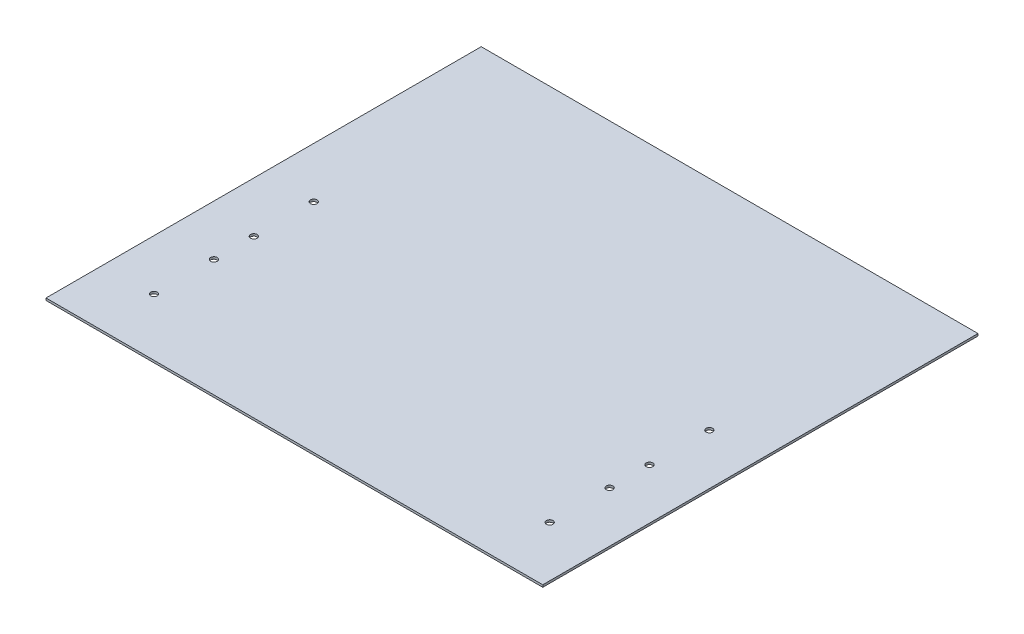
ISO-10303-21;
HEADER;
FILE_DESCRIPTION(('STEP AP214'),'2;1');
FILE_NAME('part.step','',(''),(''),'','','');
FILE_SCHEMA(('AUTOMOTIVE_DESIGN { 1 0 10303 214 1 1 1 1 }'));
ENDSEC;
DATA;
#1=APPLICATION_CONTEXT('core data for automotive mechanical design processes');
#2=APPLICATION_PROTOCOL_DEFINITION('international standard','automotive_design',2000,#1);
#3=PRODUCT_CONTEXT('',#1,'mechanical');
#4=PRODUCT('Part','Part','',(#3));
#5=PRODUCT_RELATED_PRODUCT_CATEGORY('part','',(#4));
#6=PRODUCT_DEFINITION_FORMATION('','',#4);
#7=PRODUCT_DEFINITION_CONTEXT('part definition',#1,'design');
#8=PRODUCT_DEFINITION('design','',#6,#7);
#9=PRODUCT_DEFINITION_SHAPE('','',#8);
#10=(LENGTH_UNIT() NAMED_UNIT(*) SI_UNIT(.MILLI.,.METRE.));
#11=(NAMED_UNIT(*) PLANE_ANGLE_UNIT() SI_UNIT($,.RADIAN.));
#12=(NAMED_UNIT(*) SI_UNIT($,.STERADIAN.) SOLID_ANGLE_UNIT());
#13=UNCERTAINTY_MEASURE_WITH_UNIT(LENGTH_MEASURE(1.E-05),#10,'distance_accuracy_value','');
#14=(GEOMETRIC_REPRESENTATION_CONTEXT(3) GLOBAL_UNCERTAINTY_ASSIGNED_CONTEXT((#13)) GLOBAL_UNIT_ASSIGNED_CONTEXT((#10,
#11,#12)) REPRESENTATION_CONTEXT('',''));
#15=CARTESIAN_POINT('',(0.,0.,0.));
#16=DIRECTION('',(0.,0.,1.));
#17=DIRECTION('',(1.,0.,0.));
#18=AXIS2_PLACEMENT_3D('',#15,#16,#17);
#19=CARTESIAN_POINT('',(0.,1.,0.));
#20=DIRECTION('',(1.,0.,0.));
#21=DIRECTION('',(0.,0.,-1.));
#22=AXIS2_PLACEMENT_3D('',#19,#20,#21);
#23=PLANE('',#22);
#24=DIRECTION('',(0.,0.,1.));
#25=VECTOR('',#24,1.);
#26=CARTESIAN_POINT('',(0.,0.,0.));
#27=LINE('',#26,#25);
#28=CARTESIAN_POINT('',(0.,0.,-198.));
#29=VERTEX_POINT('',#28);
#30=CARTESIAN_POINT('',(0.,0.,0.));
#31=VERTEX_POINT('',#30);
#32=EDGE_CURVE('E96',#29,#31,#27,.T.);
#33=ORIENTED_EDGE('',*,*,#32,.T.);
#34=DIRECTION('',(0.,-1.,0.));
#35=VECTOR('',#34,1.);
#36=CARTESIAN_POINT('',(0.,1.,0.));
#37=LINE('',#36,#35);
#38=CARTESIAN_POINT('',(0.,1.,0.));
#39=VERTEX_POINT('',#38);
#40=EDGE_CURVE('E11',#39,#31,#37,.T.);
#41=ORIENTED_EDGE('',*,*,#40,.F.);
#42=DIRECTION('',(0.,0.,1.));
#43=VECTOR('',#42,1.);
#44=CARTESIAN_POINT('',(0.,1.,0.));
#45=LINE('',#44,#43);
#46=CARTESIAN_POINT('',(0.,1.,-198.));
#47=VERTEX_POINT('',#46);
#48=EDGE_CURVE('E84',#47,#39,#45,.T.);
#49=ORIENTED_EDGE('',*,*,#48,.F.);
#50=DIRECTION('',(0.,-1.,0.));
#51=VECTOR('',#50,1.);
#52=CARTESIAN_POINT('',(0.,1.,-198.));
#53=LINE('',#52,#51);
#54=EDGE_CURVE('E92',#47,#29,#53,.T.);
#55=ORIENTED_EDGE('',*,*,#54,.T.);
#56=EDGE_LOOP('',(#33,#41,#49,#55));
#57=FACE_BOUND('',#56,.T.);
#58=ADVANCED_FACE('F33',(#57),#23,.F.);
#59=CARTESIAN_POINT('',(0.,1.,0.));
#60=DIRECTION('',(0.,0.,-1.));
#61=DIRECTION('',(-1.,0.,0.));
#62=AXIS2_PLACEMENT_3D('',#59,#60,#61);
#63=PLANE('',#62);
#64=DIRECTION('',(1.,0.,0.));
#65=VECTOR('',#64,1.);
#66=CARTESIAN_POINT('',(0.,0.,0.));
#67=LINE('',#66,#65);
#68=CARTESIAN_POINT('',(226.,0.,0.));
#69=VERTEX_POINT('',#68);
#70=EDGE_CURVE('E88',#31,#69,#67,.T.);
#71=ORIENTED_EDGE('',*,*,#70,.T.);
#72=DIRECTION('',(0.,-1.,0.));
#73=VECTOR('',#72,1.);
#74=CARTESIAN_POINT('',(226.,1.,0.));
#75=LINE('',#74,#73);
#76=CARTESIAN_POINT('',(226.,1.,0.));
#77=VERTEX_POINT('',#76);
#78=EDGE_CURVE('E41',#77,#69,#75,.T.);
#79=ORIENTED_EDGE('',*,*,#78,.F.);
#80=DIRECTION('',(1.,0.,0.));
#81=VECTOR('',#80,1.);
#82=CARTESIAN_POINT('',(0.,1.,0.));
#83=LINE('',#82,#81);
#84=EDGE_CURVE('E79',#39,#77,#83,.T.);
#85=ORIENTED_EDGE('',*,*,#84,.F.);
#86=ORIENTED_EDGE('',*,*,#40,.T.);
#87=EDGE_LOOP('',(#71,#79,#85,#86));
#88=FACE_BOUND('',#87,.T.);
#89=ADVANCED_FACE('F87',(#88),#63,.F.);
#90=CARTESIAN_POINT('',(226.,1.,0.));
#91=DIRECTION('',(-1.,0.,0.));
#92=DIRECTION('',(0.,0.,1.));
#93=AXIS2_PLACEMENT_3D('',#90,#91,#92);
#94=PLANE('',#93);
#95=DIRECTION('',(0.,0.,-1.));
#96=VECTOR('',#95,1.);
#97=CARTESIAN_POINT('',(226.,0.,0.));
#98=LINE('',#97,#96);
#99=CARTESIAN_POINT('',(226.,0.,-198.));
#100=VERTEX_POINT('',#99);
#101=EDGE_CURVE('E66',#69,#100,#98,.T.);
#102=ORIENTED_EDGE('',*,*,#101,.T.);
#103=DIRECTION('',(0.,-1.,0.));
#104=VECTOR('',#103,1.);
#105=CARTESIAN_POINT('',(226.,1.,-198.));
#106=LINE('',#105,#104);
#107=CARTESIAN_POINT('',(226.,1.,-198.));
#108=VERTEX_POINT('',#107);
#109=EDGE_CURVE('E89',#108,#100,#106,.T.);
#110=ORIENTED_EDGE('',*,*,#109,.F.);
#111=DIRECTION('',(0.,0.,-1.));
#112=VECTOR('',#111,1.);
#113=CARTESIAN_POINT('',(226.,1.,0.));
#114=LINE('',#113,#112);
#115=EDGE_CURVE('E82',#77,#108,#114,.T.);
#116=ORIENTED_EDGE('',*,*,#115,.F.);
#117=ORIENTED_EDGE('',*,*,#78,.T.);
#118=EDGE_LOOP('',(#102,#110,#116,#117));
#119=FACE_BOUND('',#118,.T.);
#120=ADVANCED_FACE('F90',(#119),#94,.F.);
#121=CARTESIAN_POINT('',(0.,1.,-198.));
#122=DIRECTION('',(0.,0.,1.));
#123=DIRECTION('',(1.,0.,0.));
#124=AXIS2_PLACEMENT_3D('',#121,#122,#123);
#125=PLANE('',#124);
#126=DIRECTION('',(-1.,0.,0.));
#127=VECTOR('',#126,1.);
#128=CARTESIAN_POINT('',(0.,0.,-198.));
#129=LINE('',#128,#127);
#130=EDGE_CURVE('E72',#100,#29,#129,.T.);
#131=ORIENTED_EDGE('',*,*,#130,.T.);
#132=ORIENTED_EDGE('',*,*,#54,.F.);
#133=DIRECTION('',(-1.,0.,0.));
#134=VECTOR('',#133,1.);
#135=CARTESIAN_POINT('',(0.,1.,-198.));
#136=LINE('',#135,#134);
#137=EDGE_CURVE('E49',#108,#47,#136,.T.);
#138=ORIENTED_EDGE('',*,*,#137,.F.);
#139=ORIENTED_EDGE('',*,*,#109,.T.);
#140=EDGE_LOOP('',(#131,#132,#138,#139));
#141=FACE_BOUND('',#140,.T.);
#142=ADVANCED_FACE('F104',(#141),#125,.F.);
#143=CARTESIAN_POINT('',(0.,1.,0.));
#144=DIRECTION('',(0.,-1.,0.));
#145=DIRECTION('',(0.,0.,-1.));
#146=AXIS2_PLACEMENT_3D('',#143,#144,#145);
#147=PLANE('',#146);
#148=CARTESIAN_POINT('',(23.,1.,-53.4));
#149=DIRECTION('',(0.,1.,0.));
#150=DIRECTION('',(0.,0.,1.));
#151=AXIS2_PLACEMENT_3D('',#148,#149,#150);
#152=CIRCLE('',#151,1.49999999999997);
#153=CARTESIAN_POINT('',(23.,1.,-51.9));
#154=VERTEX_POINT('',#153);
#155=EDGE_CURVE('E135',#154,#154,#152,.T.);
#156=ORIENTED_EDGE('',*,*,#155,.F.);
#157=EDGE_LOOP('',(#156));
#158=FACE_BOUND('',#157,.T.);
#159=CARTESIAN_POINT('',(23.,1.,-71.5577619712243));
#160=DIRECTION('',(0.,1.,0.));
#161=DIRECTION('',(0.,0.,1.));
#162=AXIS2_PLACEMENT_3D('',#159,#160,#161);
#163=CIRCLE('',#162,1.49999999999997);
#164=CARTESIAN_POINT('',(23.,1.,-70.0577619712243));
#165=VERTEX_POINT('',#164);
#166=EDGE_CURVE('E129',#165,#165,#163,.T.);
#167=ORIENTED_EDGE('',*,*,#166,.F.);
#168=EDGE_LOOP('',(#167));
#169=FACE_BOUND('',#168,.T.);
#170=CARTESIAN_POINT('',(203.,1.,-26.16));
#171=DIRECTION('',(0.,1.,0.));
#172=DIRECTION('',(0.,0.,-1.));
#173=AXIS2_PLACEMENT_3D('',#170,#171,#172);
#174=CIRCLE('',#173,1.49999999999997);
#175=CARTESIAN_POINT('',(203.,1.,-27.66));
#176=VERTEX_POINT('',#175);
#177=EDGE_CURVE('E123',#176,#176,#174,.T.);
#178=ORIENTED_EDGE('',*,*,#177,.F.);
#179=EDGE_LOOP('',(#178));
#180=FACE_BOUND('',#179,.T.);
#181=CARTESIAN_POINT('',(203.,1.,-53.4));
#182=DIRECTION('',(0.,1.,0.));
#183=DIRECTION('',(0.,0.,-1.));
#184=AXIS2_PLACEMENT_3D('',#181,#182,#183);
#185=CIRCLE('',#184,1.49999999999997);
#186=CARTESIAN_POINT('',(203.,1.,-54.9));
#187=VERTEX_POINT('',#186);
#188=EDGE_CURVE('E116',#187,#187,#185,.T.);
#189=ORIENTED_EDGE('',*,*,#188,.F.);
#190=EDGE_LOOP('',(#189));
#191=FACE_BOUND('',#190,.T.);
#192=CARTESIAN_POINT('',(203.,1.,-71.5577619712243));
#193=DIRECTION('',(0.,1.,0.));
#194=DIRECTION('',(0.,0.,-1.));
#195=AXIS2_PLACEMENT_3D('',#192,#193,#194);
#196=CIRCLE('',#195,1.49999999999997);
#197=CARTESIAN_POINT('',(203.,1.,-73.0577619712242));
#198=VERTEX_POINT('',#197);
#199=EDGE_CURVE('E152',#198,#198,#196,.T.);
#200=ORIENTED_EDGE('',*,*,#199,.F.);
#201=EDGE_LOOP('',(#200));
#202=FACE_BOUND('',#201,.T.);
#203=CARTESIAN_POINT('',(203.,1.,-98.7977619948428));
#204=DIRECTION('',(0.,1.,0.));
#205=DIRECTION('',(0.,0.,-1.));
#206=AXIS2_PLACEMENT_3D('',#203,#204,#205);
#207=CIRCLE('',#206,1.49999999999997);
#208=CARTESIAN_POINT('',(203.,1.,-100.297761994843));
#209=VERTEX_POINT('',#208);
#210=EDGE_CURVE('E146',#209,#209,#207,.T.);
#211=ORIENTED_EDGE('',*,*,#210,.F.);
#212=EDGE_LOOP('',(#211));
#213=FACE_BOUND('',#212,.T.);
#214=CARTESIAN_POINT('',(23.,1.,-98.7977619948428));
#215=DIRECTION('',(0.,1.,0.));
#216=DIRECTION('',(0.,0.,1.));
#217=AXIS2_PLACEMENT_3D('',#214,#215,#216);
#218=CIRCLE('',#217,1.49999999999997);
#219=CARTESIAN_POINT('',(23.,1.,-97.2977619948428));
#220=VERTEX_POINT('',#219);
#221=EDGE_CURVE('E140',#220,#220,#218,.T.);
#222=ORIENTED_EDGE('',*,*,#221,.F.);
#223=EDGE_LOOP('',(#222));
#224=FACE_BOUND('',#223,.T.);
#225=CARTESIAN_POINT('',(23.,1.,-26.16));
#226=DIRECTION('',(0.,1.,0.));
#227=DIRECTION('',(0.,0.,1.));
#228=AXIS2_PLACEMENT_3D('',#225,#226,#227);
#229=CIRCLE('',#228,1.49999999999997);
#230=CARTESIAN_POINT('',(23.,1.,-24.66));
#231=VERTEX_POINT('',#230);
#232=EDGE_CURVE('E110',#231,#231,#229,.T.);
#233=ORIENTED_EDGE('',*,*,#232,.F.);
#234=EDGE_LOOP('',(#233));
#235=FACE_BOUND('',#234,.T.);
#236=ORIENTED_EDGE('',*,*,#48,.T.);
#237=ORIENTED_EDGE('',*,*,#84,.T.);
#238=ORIENTED_EDGE('',*,*,#115,.T.);
#239=ORIENTED_EDGE('',*,*,#137,.T.);
#240=EDGE_LOOP('',(#236,#237,#238,#239));
#241=FACE_BOUND('',#240,.T.);
#242=ADVANCED_FACE('F80',(#158,#169,#180,#191,#202,#213,#224,#235,#241),#147,.F.);
#243=CARTESIAN_POINT('',(0.,0.,0.));
#244=DIRECTION('',(0.,-1.,0.));
#245=DIRECTION('',(0.,0.,-1.));
#246=AXIS2_PLACEMENT_3D('',#243,#244,#245);
#247=PLANE('',#246);
#248=CARTESIAN_POINT('',(23.,0.,-53.4));
#249=DIRECTION('',(0.,1.,0.));
#250=DIRECTION('',(0.,0.,1.));
#251=AXIS2_PLACEMENT_3D('',#248,#249,#250);
#252=CIRCLE('',#251,1.49999999999997);
#253=CARTESIAN_POINT('',(23.,0.,-51.9));
#254=VERTEX_POINT('',#253);
#255=EDGE_CURVE('E113',#254,#254,#252,.T.);
#256=ORIENTED_EDGE('',*,*,#255,.T.);
#257=EDGE_LOOP('',(#256));
#258=FACE_BOUND('',#257,.T.);
#259=CARTESIAN_POINT('',(23.,0.,-71.5577619712243));
#260=DIRECTION('',(0.,1.,0.));
#261=DIRECTION('',(0.,0.,1.));
#262=AXIS2_PLACEMENT_3D('',#259,#260,#261);
#263=CIRCLE('',#262,1.49999999999997);
#264=CARTESIAN_POINT('',(23.,0.,-70.0577619712243));
#265=VERTEX_POINT('',#264);
#266=EDGE_CURVE('E132',#265,#265,#263,.T.);
#267=ORIENTED_EDGE('',*,*,#266,.T.);
#268=EDGE_LOOP('',(#267));
#269=FACE_BOUND('',#268,.T.);
#270=CARTESIAN_POINT('',(203.,0.,-26.16));
#271=DIRECTION('',(0.,1.,0.));
#272=DIRECTION('',(0.,0.,-1.));
#273=AXIS2_PLACEMENT_3D('',#270,#271,#272);
#274=CIRCLE('',#273,1.49999999999997);
#275=CARTESIAN_POINT('',(203.,0.,-27.66));
#276=VERTEX_POINT('',#275);
#277=EDGE_CURVE('E126',#276,#276,#274,.T.);
#278=ORIENTED_EDGE('',*,*,#277,.T.);
#279=EDGE_LOOP('',(#278));
#280=FACE_BOUND('',#279,.T.);
#281=CARTESIAN_POINT('',(203.,0.,-53.4));
#282=DIRECTION('',(0.,1.,0.));
#283=DIRECTION('',(0.,0.,-1.));
#284=AXIS2_PLACEMENT_3D('',#281,#282,#283);
#285=CIRCLE('',#284,1.49999999999997);
#286=CARTESIAN_POINT('',(203.,0.,-54.9));
#287=VERTEX_POINT('',#286);
#288=EDGE_CURVE('E119',#287,#287,#285,.T.);
#289=ORIENTED_EDGE('',*,*,#288,.T.);
#290=EDGE_LOOP('',(#289));
#291=FACE_BOUND('',#290,.T.);
#292=CARTESIAN_POINT('',(203.,0.,-71.5577619712243));
#293=DIRECTION('',(0.,1.,0.));
#294=DIRECTION('',(0.,0.,-1.));
#295=AXIS2_PLACEMENT_3D('',#292,#293,#294);
#296=CIRCLE('',#295,1.49999999999997);
#297=CARTESIAN_POINT('',(203.,0.,-73.0577619712242));
#298=VERTEX_POINT('',#297);
#299=EDGE_CURVE('E120',#298,#298,#296,.T.);
#300=ORIENTED_EDGE('',*,*,#299,.T.);
#301=EDGE_LOOP('',(#300));
#302=FACE_BOUND('',#301,.T.);
#303=CARTESIAN_POINT('',(203.,0.,-98.7977619948428));
#304=DIRECTION('',(0.,1.,0.));
#305=DIRECTION('',(0.,0.,-1.));
#306=AXIS2_PLACEMENT_3D('',#303,#304,#305);
#307=CIRCLE('',#306,1.49999999999997);
#308=CARTESIAN_POINT('',(203.,0.,-100.297761994843));
#309=VERTEX_POINT('',#308);
#310=EDGE_CURVE('E149',#309,#309,#307,.T.);
#311=ORIENTED_EDGE('',*,*,#310,.T.);
#312=EDGE_LOOP('',(#311));
#313=FACE_BOUND('',#312,.T.);
#314=CARTESIAN_POINT('',(23.,0.,-98.7977619948428));
#315=DIRECTION('',(0.,1.,0.));
#316=DIRECTION('',(0.,0.,1.));
#317=AXIS2_PLACEMENT_3D('',#314,#315,#316);
#318=CIRCLE('',#317,1.49999999999997);
#319=CARTESIAN_POINT('',(23.,0.,-97.2977619948428));
#320=VERTEX_POINT('',#319);
#321=EDGE_CURVE('E143',#320,#320,#318,.T.);
#322=ORIENTED_EDGE('',*,*,#321,.T.);
#323=EDGE_LOOP('',(#322));
#324=FACE_BOUND('',#323,.T.);
#325=CARTESIAN_POINT('',(23.,0.,-26.16));
#326=DIRECTION('',(0.,1.,0.));
#327=DIRECTION('',(0.,0.,1.));
#328=AXIS2_PLACEMENT_3D('',#325,#326,#327);
#329=CIRCLE('',#328,1.49999999999997);
#330=CARTESIAN_POINT('',(23.,0.,-24.66));
#331=VERTEX_POINT('',#330);
#332=EDGE_CURVE('E99',#331,#331,#329,.T.);
#333=ORIENTED_EDGE('',*,*,#332,.T.);
#334=EDGE_LOOP('',(#333));
#335=FACE_BOUND('',#334,.T.);
#336=ORIENTED_EDGE('',*,*,#32,.F.);
#337=ORIENTED_EDGE('',*,*,#130,.F.);
#338=ORIENTED_EDGE('',*,*,#101,.F.);
#339=ORIENTED_EDGE('',*,*,#70,.F.);
#340=EDGE_LOOP('',(#336,#337,#338,#339));
#341=FACE_BOUND('',#340,.T.);
#342=ADVANCED_FACE('F107',(#258,#269,#280,#291,#302,#313,#324,#335,#341),#247,.T.);
#343=CARTESIAN_POINT('',(23.,0.,-26.16));
#344=DIRECTION('',(0.,1.,0.));
#345=DIRECTION('',(0.,0.,1.));
#346=AXIS2_PLACEMENT_3D('',#343,#344,#345);
#347=CYLINDRICAL_SURFACE('',#346,1.49999999999997);
#348=ORIENTED_EDGE('',*,*,#332,.F.);
#349=EDGE_LOOP('',(#348));
#350=FACE_BOUND('',#349,.T.);
#351=ORIENTED_EDGE('',*,*,#232,.T.);
#352=EDGE_LOOP('',(#351));
#353=FACE_BOUND('',#352,.T.);
#354=ADVANCED_FACE('F178',(#350,#353),#347,.F.);
#355=CARTESIAN_POINT('',(23.,0.,-98.7977619948428));
#356=DIRECTION('',(0.,1.,0.));
#357=DIRECTION('',(0.,0.,1.));
#358=AXIS2_PLACEMENT_3D('',#355,#356,#357);
#359=CYLINDRICAL_SURFACE('',#358,1.49999999999997);
#360=ORIENTED_EDGE('',*,*,#321,.F.);
#361=EDGE_LOOP('',(#360));
#362=FACE_BOUND('',#361,.T.);
#363=ORIENTED_EDGE('',*,*,#221,.T.);
#364=EDGE_LOOP('',(#363));
#365=FACE_BOUND('',#364,.T.);
#366=ADVANCED_FACE('F180',(#362,#365),#359,.F.);
#367=CARTESIAN_POINT('',(203.,0.,-98.7977619948428));
#368=DIRECTION('',(0.,1.,0.));
#369=DIRECTION('',(0.,0.,1.));
#370=AXIS2_PLACEMENT_3D('',#367,#368,#369);
#371=CYLINDRICAL_SURFACE('',#370,1.49999999999997);
#372=ORIENTED_EDGE('',*,*,#310,.F.);
#373=EDGE_LOOP('',(#372));
#374=FACE_BOUND('',#373,.T.);
#375=ORIENTED_EDGE('',*,*,#210,.T.);
#376=EDGE_LOOP('',(#375));
#377=FACE_BOUND('',#376,.T.);
#378=ADVANCED_FACE('F164',(#374,#377),#371,.F.);
#379=CARTESIAN_POINT('',(203.,0.,-71.5577619712243));
#380=DIRECTION('',(0.,1.,0.));
#381=DIRECTION('',(0.,0.,1.));
#382=AXIS2_PLACEMENT_3D('',#379,#380,#381);
#383=CYLINDRICAL_SURFACE('',#382,1.49999999999997);
#384=ORIENTED_EDGE('',*,*,#299,.F.);
#385=EDGE_LOOP('',(#384));
#386=FACE_BOUND('',#385,.T.);
#387=ORIENTED_EDGE('',*,*,#199,.T.);
#388=EDGE_LOOP('',(#387));
#389=FACE_BOUND('',#388,.T.);
#390=ADVANCED_FACE('F160',(#386,#389),#383,.F.);
#391=CARTESIAN_POINT('',(203.,0.,-53.4));
#392=DIRECTION('',(0.,1.,0.));
#393=DIRECTION('',(0.,0.,1.));
#394=AXIS2_PLACEMENT_3D('',#391,#392,#393);
#395=CYLINDRICAL_SURFACE('',#394,1.49999999999997);
#396=ORIENTED_EDGE('',*,*,#288,.F.);
#397=EDGE_LOOP('',(#396));
#398=FACE_BOUND('',#397,.T.);
#399=ORIENTED_EDGE('',*,*,#188,.T.);
#400=EDGE_LOOP('',(#399));
#401=FACE_BOUND('',#400,.T.);
#402=ADVANCED_FACE('F163',(#398,#401),#395,.F.);
#403=CARTESIAN_POINT('',(203.,0.,-26.16));
#404=DIRECTION('',(0.,1.,0.));
#405=DIRECTION('',(0.,0.,1.));
#406=AXIS2_PLACEMENT_3D('',#403,#404,#405);
#407=CYLINDRICAL_SURFACE('',#406,1.49999999999997);
#408=ORIENTED_EDGE('',*,*,#277,.F.);
#409=EDGE_LOOP('',(#408));
#410=FACE_BOUND('',#409,.T.);
#411=ORIENTED_EDGE('',*,*,#177,.T.);
#412=EDGE_LOOP('',(#411));
#413=FACE_BOUND('',#412,.T.);
#414=ADVANCED_FACE('F251',(#410,#413),#407,.F.);
#415=CARTESIAN_POINT('',(23.,0.,-71.5577619712243));
#416=DIRECTION('',(0.,1.,0.));
#417=DIRECTION('',(0.,0.,1.));
#418=AXIS2_PLACEMENT_3D('',#415,#416,#417);
#419=CYLINDRICAL_SURFACE('',#418,1.49999999999997);
#420=ORIENTED_EDGE('',*,*,#266,.F.);
#421=EDGE_LOOP('',(#420));
#422=FACE_BOUND('',#421,.T.);
#423=ORIENTED_EDGE('',*,*,#166,.T.);
#424=EDGE_LOOP('',(#423));
#425=FACE_BOUND('',#424,.T.);
#426=ADVANCED_FACE('F260',(#422,#425),#419,.F.);
#427=CARTESIAN_POINT('',(23.,0.,-53.4));
#428=DIRECTION('',(0.,1.,0.));
#429=DIRECTION('',(0.,0.,1.));
#430=AXIS2_PLACEMENT_3D('',#427,#428,#429);
#431=CYLINDRICAL_SURFACE('',#430,1.49999999999997);
#432=ORIENTED_EDGE('',*,*,#255,.F.);
#433=EDGE_LOOP('',(#432));
#434=FACE_BOUND('',#433,.T.);
#435=ORIENTED_EDGE('',*,*,#155,.T.);
#436=EDGE_LOOP('',(#435));
#437=FACE_BOUND('',#436,.T.);
#438=ADVANCED_FACE('F270',(#434,#437),#431,.F.);
#439=CLOSED_SHELL('',(#58,#89,#120,#142,#242,#342,#354,#366,#378,#390,#402,#414,#426,#438));
#440=MANIFOLD_SOLID_BREP('B2',#439);
#441=ADVANCED_BREP_SHAPE_REPRESENTATION('',(#18,#440),#14);
#442=SHAPE_DEFINITION_REPRESENTATION(#9,#441);
ENDSEC;
END-ISO-10303-21;
